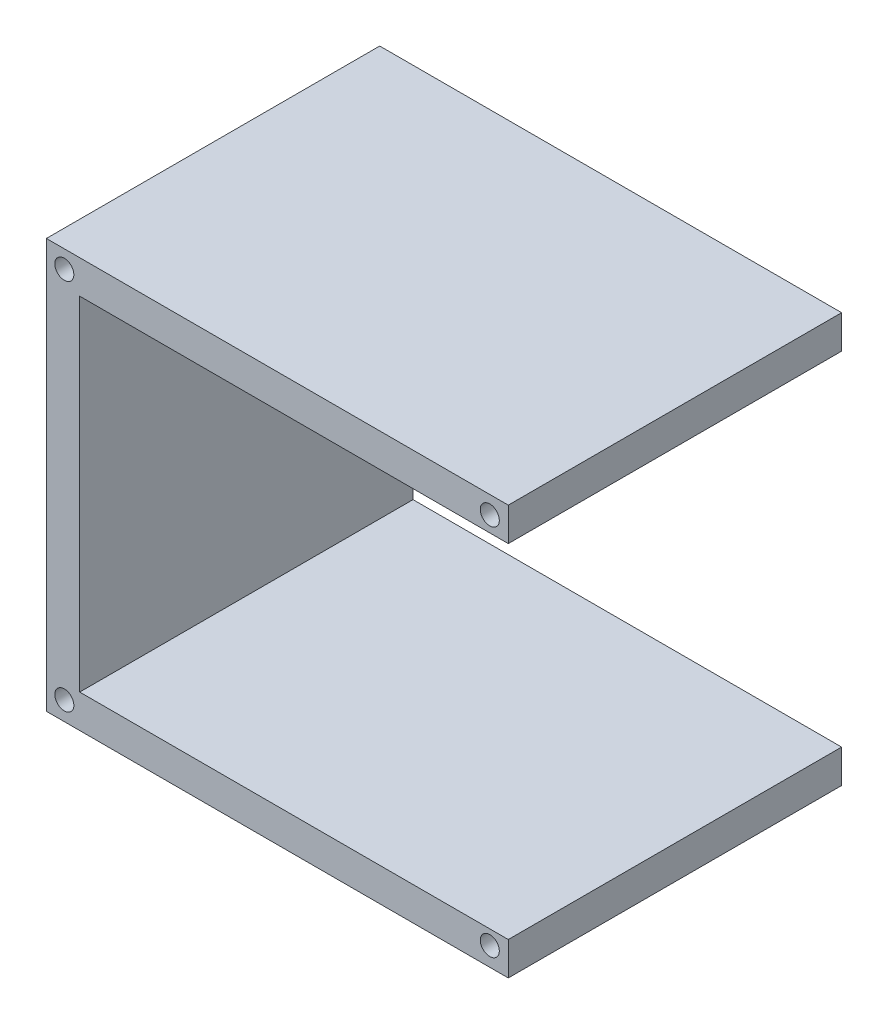
ISO-10303-21;
HEADER;
FILE_DESCRIPTION(('STEP AP214'),'2;1');
FILE_NAME('part.step','',(''),(''),'','','');
FILE_SCHEMA(('AUTOMOTIVE_DESIGN { 1 0 10303 214 1 1 1 1 }'));
ENDSEC;
DATA;
#1=APPLICATION_CONTEXT('core data for automotive mechanical design processes');
#2=APPLICATION_PROTOCOL_DEFINITION('international standard','automotive_design',2000,#1);
#3=PRODUCT_CONTEXT('',#1,'mechanical');
#4=PRODUCT('Part','Part','',(#3));
#5=PRODUCT_RELATED_PRODUCT_CATEGORY('part','',(#4));
#6=PRODUCT_DEFINITION_FORMATION('','',#4);
#7=PRODUCT_DEFINITION_CONTEXT('part definition',#1,'design');
#8=PRODUCT_DEFINITION('design','',#6,#7);
#9=PRODUCT_DEFINITION_SHAPE('','',#8);
#10=(LENGTH_UNIT() NAMED_UNIT(*) SI_UNIT(.MILLI.,.METRE.));
#11=(NAMED_UNIT(*) PLANE_ANGLE_UNIT() SI_UNIT($,.RADIAN.));
#12=(NAMED_UNIT(*) SI_UNIT($,.STERADIAN.) SOLID_ANGLE_UNIT());
#13=UNCERTAINTY_MEASURE_WITH_UNIT(LENGTH_MEASURE(1.E-05),#10,'distance_accuracy_value','');
#14=(GEOMETRIC_REPRESENTATION_CONTEXT(3) GLOBAL_UNCERTAINTY_ASSIGNED_CONTEXT((#13)) GLOBAL_UNIT_ASSIGNED_CONTEXT((#10,
#11,#12)) REPRESENTATION_CONTEXT('',''));
#15=CARTESIAN_POINT('',(0.,0.,0.));
#16=DIRECTION('',(0.,0.,1.));
#17=DIRECTION('',(1.,0.,0.));
#18=AXIS2_PLACEMENT_3D('',#15,#16,#17);
#19=CARTESIAN_POINT('',(0.,43.,35.));
#20=DIRECTION('',(1.,0.,0.));
#21=DIRECTION('',(0.,1.,0.));
#22=AXIS2_PLACEMENT_3D('',#19,#20,#21);
#23=PLANE('',#22);
#24=DIRECTION('',(0.,-1.,0.));
#25=VECTOR('',#24,1.);
#26=CARTESIAN_POINT('',(0.,43.,0.));
#27=LINE('',#26,#25);
#28=CARTESIAN_POINT('',(0.,43.,0.));
#29=VERTEX_POINT('',#28);
#30=CARTESIAN_POINT('',(0.,0.,0.));
#31=VERTEX_POINT('',#30);
#32=EDGE_CURVE('E144',#29,#31,#27,.T.);
#33=ORIENTED_EDGE('',*,*,#32,.T.);
#34=DIRECTION('',(0.,0.,-1.));
#35=VECTOR('',#34,1.);
#36=CARTESIAN_POINT('',(0.,0.,35.));
#37=LINE('',#36,#35);
#38=CARTESIAN_POINT('',(0.,0.,35.));
#39=VERTEX_POINT('',#38);
#40=EDGE_CURVE('E11',#39,#31,#37,.T.);
#41=ORIENTED_EDGE('',*,*,#40,.F.);
#42=DIRECTION('',(0.,-1.,0.));
#43=VECTOR('',#42,1.);
#44=CARTESIAN_POINT('',(0.,43.,35.));
#45=LINE('',#44,#43);
#46=CARTESIAN_POINT('',(0.,43.,35.));
#47=VERTEX_POINT('',#46);
#48=EDGE_CURVE('E167',#47,#39,#45,.T.);
#49=ORIENTED_EDGE('',*,*,#48,.F.);
#50=DIRECTION('',(0.,0.,-1.));
#51=VECTOR('',#50,1.);
#52=CARTESIAN_POINT('',(0.,43.,35.));
#53=LINE('',#52,#51);
#54=EDGE_CURVE('E140',#47,#29,#53,.T.);
#55=ORIENTED_EDGE('',*,*,#54,.T.);
#56=EDGE_LOOP('',(#33,#41,#49,#55));
#57=FACE_BOUND('',#56,.T.);
#58=ADVANCED_FACE('F43',(#57),#23,.F.);
#59=CARTESIAN_POINT('',(0.,0.,35.));
#60=DIRECTION('',(0.,1.,0.));
#61=DIRECTION('',(0.,0.,1.));
#62=AXIS2_PLACEMENT_3D('',#59,#60,#61);
#63=PLANE('',#62);
#64=DIRECTION('',(1.,0.,0.));
#65=VECTOR('',#64,1.);
#66=CARTESIAN_POINT('',(0.,0.,0.));
#67=LINE('',#66,#65);
#68=CARTESIAN_POINT('',(48.5,0.,0.));
#69=VERTEX_POINT('',#68);
#70=EDGE_CURVE('E148',#31,#69,#67,.T.);
#71=ORIENTED_EDGE('',*,*,#70,.T.);
#72=DIRECTION('',(0.,0.,-1.));
#73=VECTOR('',#72,1.);
#74=CARTESIAN_POINT('',(48.5,0.,35.));
#75=LINE('',#74,#73);
#76=CARTESIAN_POINT('',(48.5,0.,35.));
#77=VERTEX_POINT('',#76);
#78=EDGE_CURVE('E52',#77,#69,#75,.T.);
#79=ORIENTED_EDGE('',*,*,#78,.F.);
#80=DIRECTION('',(1.,0.,0.));
#81=VECTOR('',#80,1.);
#82=CARTESIAN_POINT('',(0.,0.,35.));
#83=LINE('',#82,#81);
#84=EDGE_CURVE('E103',#39,#77,#83,.T.);
#85=ORIENTED_EDGE('',*,*,#84,.F.);
#86=ORIENTED_EDGE('',*,*,#40,.T.);
#87=EDGE_LOOP('',(#71,#79,#85,#86));
#88=FACE_BOUND('',#87,.T.);
#89=ADVANCED_FACE('F271',(#88),#63,.F.);
#90=CARTESIAN_POINT('',(48.5,0.,35.));
#91=DIRECTION('',(-1.,0.,0.));
#92=DIRECTION('',(0.,0.,1.));
#93=AXIS2_PLACEMENT_3D('',#90,#91,#92);
#94=PLANE('',#93);
#95=DIRECTION('',(0.,1.,0.));
#96=VECTOR('',#95,1.);
#97=CARTESIAN_POINT('',(48.5,0.,0.));
#98=LINE('',#97,#96);
#99=CARTESIAN_POINT('',(48.5,3.5,0.));
#100=VERTEX_POINT('',#99);
#101=EDGE_CURVE('E152',#69,#100,#98,.T.);
#102=ORIENTED_EDGE('',*,*,#101,.T.);
#103=DIRECTION('',(0.,0.,-1.));
#104=VECTOR('',#103,1.);
#105=CARTESIAN_POINT('',(48.5,3.5,35.));
#106=LINE('',#105,#104);
#107=CARTESIAN_POINT('',(48.5,3.5,35.));
#108=VERTEX_POINT('',#107);
#109=EDGE_CURVE('E178',#108,#100,#106,.T.);
#110=ORIENTED_EDGE('',*,*,#109,.F.);
#111=DIRECTION('',(0.,1.,0.));
#112=VECTOR('',#111,1.);
#113=CARTESIAN_POINT('',(48.5,0.,35.));
#114=LINE('',#113,#112);
#115=EDGE_CURVE('E188',#77,#108,#114,.T.);
#116=ORIENTED_EDGE('',*,*,#115,.F.);
#117=ORIENTED_EDGE('',*,*,#78,.T.);
#118=EDGE_LOOP('',(#102,#110,#116,#117));
#119=FACE_BOUND('',#118,.T.);
#120=ADVANCED_FACE('F186',(#119),#94,.F.);
#121=CARTESIAN_POINT('',(48.5,3.5,35.));
#122=DIRECTION('',(0.,-1.,0.));
#123=DIRECTION('',(1.,0.,0.));
#124=AXIS2_PLACEMENT_3D('',#121,#122,#123);
#125=PLANE('',#124);
#126=DIRECTION('',(-1.,0.,0.));
#127=VECTOR('',#126,1.);
#128=CARTESIAN_POINT('',(48.5,3.5,0.));
#129=LINE('',#128,#127);
#130=CARTESIAN_POINT('',(3.5,3.5,0.));
#131=VERTEX_POINT('',#130);
#132=EDGE_CURVE('E155',#100,#131,#129,.T.);
#133=ORIENTED_EDGE('',*,*,#132,.T.);
#134=DIRECTION('',(0.,0.,-1.));
#135=VECTOR('',#134,1.);
#136=CARTESIAN_POINT('',(3.5,3.5,35.));
#137=LINE('',#136,#135);
#138=CARTESIAN_POINT('',(3.5,3.5,35.));
#139=VERTEX_POINT('',#138);
#140=EDGE_CURVE('E174',#139,#131,#137,.T.);
#141=ORIENTED_EDGE('',*,*,#140,.F.);
#142=DIRECTION('',(-1.,0.,0.));
#143=VECTOR('',#142,1.);
#144=CARTESIAN_POINT('',(48.5,3.5,35.));
#145=LINE('',#144,#143);
#146=EDGE_CURVE('E201',#108,#139,#145,.T.);
#147=ORIENTED_EDGE('',*,*,#146,.F.);
#148=ORIENTED_EDGE('',*,*,#109,.T.);
#149=EDGE_LOOP('',(#133,#141,#147,#148));
#150=FACE_BOUND('',#149,.T.);
#151=ADVANCED_FACE('F196',(#150),#125,.F.);
#152=CARTESIAN_POINT('',(3.5,3.5,35.));
#153=DIRECTION('',(-1.,0.,0.));
#154=DIRECTION('',(0.,-1.,0.));
#155=AXIS2_PLACEMENT_3D('',#152,#153,#154);
#156=PLANE('',#155);
#157=DIRECTION('',(0.,1.,0.));
#158=VECTOR('',#157,1.);
#159=CARTESIAN_POINT('',(3.5,3.5,0.));
#160=LINE('',#159,#158);
#161=CARTESIAN_POINT('',(3.5,39.5,0.));
#162=VERTEX_POINT('',#161);
#163=EDGE_CURVE('E158',#131,#162,#160,.T.);
#164=ORIENTED_EDGE('',*,*,#163,.T.);
#165=DIRECTION('',(0.,0.,-1.));
#166=VECTOR('',#165,1.);
#167=CARTESIAN_POINT('',(3.5,39.5,35.));
#168=LINE('',#167,#166);
#169=CARTESIAN_POINT('',(3.5,39.5,35.));
#170=VERTEX_POINT('',#169);
#171=EDGE_CURVE('E133',#170,#162,#168,.T.);
#172=ORIENTED_EDGE('',*,*,#171,.F.);
#173=DIRECTION('',(0.,1.,0.));
#174=VECTOR('',#173,1.);
#175=CARTESIAN_POINT('',(3.5,3.5,35.));
#176=LINE('',#175,#174);
#177=EDGE_CURVE('E122',#139,#170,#176,.T.);
#178=ORIENTED_EDGE('',*,*,#177,.F.);
#179=ORIENTED_EDGE('',*,*,#140,.T.);
#180=EDGE_LOOP('',(#164,#172,#178,#179));
#181=FACE_BOUND('',#180,.T.);
#182=ADVANCED_FACE('F199',(#181),#156,.F.);
#183=CARTESIAN_POINT('',(3.5,39.5,35.));
#184=DIRECTION('',(0.,1.,0.));
#185=DIRECTION('',(0.,0.,1.));
#186=AXIS2_PLACEMENT_3D('',#183,#184,#185);
#187=PLANE('',#186);
#188=DIRECTION('',(1.,0.,0.));
#189=VECTOR('',#188,1.);
#190=CARTESIAN_POINT('',(3.5,39.5,0.));
#191=LINE('',#190,#189);
#192=CARTESIAN_POINT('',(48.5,39.5,0.));
#193=VERTEX_POINT('',#192);
#194=EDGE_CURVE('E131',#162,#193,#191,.T.);
#195=ORIENTED_EDGE('',*,*,#194,.T.);
#196=DIRECTION('',(0.,0.,-1.));
#197=VECTOR('',#196,1.);
#198=CARTESIAN_POINT('',(48.5,39.5,35.));
#199=LINE('',#198,#197);
#200=CARTESIAN_POINT('',(48.5,39.5,35.));
#201=VERTEX_POINT('',#200);
#202=EDGE_CURVE('E128',#201,#193,#199,.T.);
#203=ORIENTED_EDGE('',*,*,#202,.F.);
#204=DIRECTION('',(1.,0.,0.));
#205=VECTOR('',#204,1.);
#206=CARTESIAN_POINT('',(3.5,39.5,35.));
#207=LINE('',#206,#205);
#208=EDGE_CURVE('E116',#170,#201,#207,.T.);
#209=ORIENTED_EDGE('',*,*,#208,.F.);
#210=ORIENTED_EDGE('',*,*,#171,.T.);
#211=EDGE_LOOP('',(#195,#203,#209,#210));
#212=FACE_BOUND('',#211,.T.);
#213=ADVANCED_FACE('F129',(#212),#187,.F.);
#214=CARTESIAN_POINT('',(48.5,39.5,35.));
#215=DIRECTION('',(-1.,0.,0.));
#216=DIRECTION('',(0.,0.,1.));
#217=AXIS2_PLACEMENT_3D('',#214,#215,#216);
#218=PLANE('',#217);
#219=DIRECTION('',(0.,1.,0.));
#220=VECTOR('',#219,1.);
#221=CARTESIAN_POINT('',(48.5,39.5,0.));
#222=LINE('',#221,#220);
#223=CARTESIAN_POINT('',(48.5,43.,0.));
#224=VERTEX_POINT('',#223);
#225=EDGE_CURVE('E89',#193,#224,#222,.T.);
#226=ORIENTED_EDGE('',*,*,#225,.T.);
#227=DIRECTION('',(0.,0.,-1.));
#228=VECTOR('',#227,1.);
#229=CARTESIAN_POINT('',(48.5,43.,35.));
#230=LINE('',#229,#228);
#231=CARTESIAN_POINT('',(48.5,43.,35.));
#232=VERTEX_POINT('',#231);
#233=EDGE_CURVE('E134',#232,#224,#230,.T.);
#234=ORIENTED_EDGE('',*,*,#233,.F.);
#235=DIRECTION('',(0.,1.,0.));
#236=VECTOR('',#235,1.);
#237=CARTESIAN_POINT('',(48.5,39.5,35.));
#238=LINE('',#237,#236);
#239=EDGE_CURVE('E120',#201,#232,#238,.T.);
#240=ORIENTED_EDGE('',*,*,#239,.F.);
#241=ORIENTED_EDGE('',*,*,#202,.T.);
#242=EDGE_LOOP('',(#226,#234,#240,#241));
#243=FACE_BOUND('',#242,.T.);
#244=ADVANCED_FACE('F136',(#243),#218,.F.);
#245=CARTESIAN_POINT('',(48.5,43.,35.));
#246=DIRECTION('',(0.,-1.,0.));
#247=DIRECTION('',(1.,0.,0.));
#248=AXIS2_PLACEMENT_3D('',#245,#246,#247);
#249=PLANE('',#248);
#250=DIRECTION('',(-1.,0.,0.));
#251=VECTOR('',#250,1.);
#252=CARTESIAN_POINT('',(48.5,43.,0.));
#253=LINE('',#252,#251);
#254=EDGE_CURVE('E95',#224,#29,#253,.T.);
#255=ORIENTED_EDGE('',*,*,#254,.T.);
#256=ORIENTED_EDGE('',*,*,#54,.F.);
#257=DIRECTION('',(-1.,0.,0.));
#258=VECTOR('',#257,1.);
#259=CARTESIAN_POINT('',(48.5,43.,35.));
#260=LINE('',#259,#258);
#261=EDGE_CURVE('E60',#232,#47,#260,.T.);
#262=ORIENTED_EDGE('',*,*,#261,.F.);
#263=ORIENTED_EDGE('',*,*,#233,.T.);
#264=EDGE_LOOP('',(#255,#256,#262,#263));
#265=FACE_BOUND('',#264,.T.);
#266=ADVANCED_FACE('F247',(#265),#249,.F.);
#267=CARTESIAN_POINT('',(0.,0.,35.));
#268=DIRECTION('',(0.,0.,1.));
#269=DIRECTION('',(1.,0.,0.));
#270=AXIS2_PLACEMENT_3D('',#267,#268,#269);
#271=PLANE('',#270);
#272=CARTESIAN_POINT('',(46.5575087678012,1.9809298281741,35.));
#273=DIRECTION('',(0.,0.,1.));
#274=DIRECTION('',(1.,0.,0.));
#275=AXIS2_PLACEMENT_3D('',#272,#273,#274);
#276=CIRCLE('',#275,0.999999999999987);
#277=CARTESIAN_POINT('',(47.5575087678012,1.9809298281741,35.));
#278=VERTEX_POINT('',#277);
#279=EDGE_CURVE('E238',#278,#278,#276,.T.);
#280=ORIENTED_EDGE('',*,*,#279,.F.);
#281=EDGE_LOOP('',(#280));
#282=FACE_BOUND('',#281,.T.);
#283=CARTESIAN_POINT('',(1.88252481078002,1.9809298281741,35.));
#284=DIRECTION('',(0.,0.,1.));
#285=DIRECTION('',(1.,0.,0.));
#286=AXIS2_PLACEMENT_3D('',#283,#284,#285);
#287=CIRCLE('',#286,0.999999999999987);
#288=CARTESIAN_POINT('',(2.88252481078,1.9809298281741,35.));
#289=VERTEX_POINT('',#288);
#290=EDGE_CURVE('E230',#289,#289,#287,.T.);
#291=ORIENTED_EDGE('',*,*,#290,.F.);
#292=EDGE_LOOP('',(#291));
#293=FACE_BOUND('',#292,.T.);
#294=CARTESIAN_POINT('',(1.88252481078002,41.1390030146638,35.));
#295=DIRECTION('',(0.,0.,1.));
#296=DIRECTION('',(1.,0.,0.));
#297=AXIS2_PLACEMENT_3D('',#294,#295,#296);
#298=CIRCLE('',#297,0.999999999999987);
#299=CARTESIAN_POINT('',(2.88252481078,41.1390030146638,35.));
#300=VERTEX_POINT('',#299);
#301=EDGE_CURVE('E222',#300,#300,#298,.T.);
#302=ORIENTED_EDGE('',*,*,#301,.F.);
#303=EDGE_LOOP('',(#302));
#304=FACE_BOUND('',#303,.T.);
#305=CARTESIAN_POINT('',(46.5575087678012,41.1390030146638,35.));
#306=DIRECTION('',(0.,0.,1.));
#307=DIRECTION('',(1.,0.,0.));
#308=AXIS2_PLACEMENT_3D('',#305,#306,#307);
#309=CIRCLE('',#308,0.999999999999987);
#310=CARTESIAN_POINT('',(47.5575087678012,41.1390030146638,35.));
#311=VERTEX_POINT('',#310);
#312=EDGE_CURVE('E214',#311,#311,#309,.T.);
#313=ORIENTED_EDGE('',*,*,#312,.F.);
#314=EDGE_LOOP('',(#313));
#315=FACE_BOUND('',#314,.T.);
#316=ORIENTED_EDGE('',*,*,#48,.T.);
#317=ORIENTED_EDGE('',*,*,#84,.T.);
#318=ORIENTED_EDGE('',*,*,#115,.T.);
#319=ORIENTED_EDGE('',*,*,#146,.T.);
#320=ORIENTED_EDGE('',*,*,#177,.T.);
#321=ORIENTED_EDGE('',*,*,#208,.T.);
#322=ORIENTED_EDGE('',*,*,#239,.T.);
#323=ORIENTED_EDGE('',*,*,#261,.T.);
#324=EDGE_LOOP('',(#316,#317,#318,#319,#320,#321,#322,#323));
#325=FACE_BOUND('',#324,.T.);
#326=ADVANCED_FACE('F118',(#282,#293,#304,#315,#325),#271,.T.);
#327=CARTESIAN_POINT('',(0.,0.,0.));
#328=DIRECTION('',(0.,0.,1.));
#329=DIRECTION('',(1.,0.,0.));
#330=AXIS2_PLACEMENT_3D('',#327,#328,#329);
#331=PLANE('',#330);
#332=CARTESIAN_POINT('',(46.5575087678012,1.9809298281741,0.));
#333=DIRECTION('',(0.,0.,1.));
#334=DIRECTION('',(1.,0.,0.));
#335=AXIS2_PLACEMENT_3D('',#332,#333,#334);
#336=CIRCLE('',#335,0.999999999999994);
#337=CARTESIAN_POINT('',(47.5575087678012,1.9809298281741,0.));
#338=VERTEX_POINT('',#337);
#339=EDGE_CURVE('E234',#338,#338,#336,.T.);
#340=ORIENTED_EDGE('',*,*,#339,.T.);
#341=EDGE_LOOP('',(#340));
#342=FACE_BOUND('',#341,.T.);
#343=CARTESIAN_POINT('',(1.88252481078002,1.9809298281741,0.));
#344=DIRECTION('',(0.,0.,1.));
#345=DIRECTION('',(1.,0.,0.));
#346=AXIS2_PLACEMENT_3D('',#343,#344,#345);
#347=CIRCLE('',#346,0.999999999999995);
#348=CARTESIAN_POINT('',(2.88252481078001,1.9809298281741,0.));
#349=VERTEX_POINT('',#348);
#350=EDGE_CURVE('E226',#349,#349,#347,.T.);
#351=ORIENTED_EDGE('',*,*,#350,.T.);
#352=EDGE_LOOP('',(#351));
#353=FACE_BOUND('',#352,.T.);
#354=CARTESIAN_POINT('',(1.88252481078002,41.1390030146638,0.));
#355=DIRECTION('',(0.,0.,1.));
#356=DIRECTION('',(1.,0.,0.));
#357=AXIS2_PLACEMENT_3D('',#354,#355,#356);
#358=CIRCLE('',#357,0.999999999999995);
#359=CARTESIAN_POINT('',(2.88252481078001,41.1390030146638,0.));
#360=VERTEX_POINT('',#359);
#361=EDGE_CURVE('E218',#360,#360,#358,.T.);
#362=ORIENTED_EDGE('',*,*,#361,.T.);
#363=EDGE_LOOP('',(#362));
#364=FACE_BOUND('',#363,.T.);
#365=CARTESIAN_POINT('',(46.5575087678012,41.1390030146638,0.));
#366=DIRECTION('',(0.,0.,1.));
#367=DIRECTION('',(1.,0.,0.));
#368=AXIS2_PLACEMENT_3D('',#365,#366,#367);
#369=CIRCLE('',#368,0.999999999999994);
#370=CARTESIAN_POINT('',(47.5575087678012,41.1390030146638,0.));
#371=VERTEX_POINT('',#370);
#372=EDGE_CURVE('E149',#371,#371,#369,.T.);
#373=ORIENTED_EDGE('',*,*,#372,.T.);
#374=EDGE_LOOP('',(#373));
#375=FACE_BOUND('',#374,.T.);
#376=ORIENTED_EDGE('',*,*,#32,.F.);
#377=ORIENTED_EDGE('',*,*,#254,.F.);
#378=ORIENTED_EDGE('',*,*,#225,.F.);
#379=ORIENTED_EDGE('',*,*,#194,.F.);
#380=ORIENTED_EDGE('',*,*,#163,.F.);
#381=ORIENTED_EDGE('',*,*,#132,.F.);
#382=ORIENTED_EDGE('',*,*,#101,.F.);
#383=ORIENTED_EDGE('',*,*,#70,.F.);
#384=EDGE_LOOP('',(#376,#377,#378,#379,#380,#381,#382,#383));
#385=FACE_BOUND('',#384,.T.);
#386=ADVANCED_FACE('F192',(#342,#353,#364,#375,#385),#331,.F.);
#387=CARTESIAN_POINT('',(46.5575087678012,41.1390030146638,35.));
#388=DIRECTION('',(0.,0.,1.));
#389=DIRECTION('',(1.,0.,0.));
#390=AXIS2_PLACEMENT_3D('',#387,#388,#389);
#391=CYLINDRICAL_SURFACE('',#390,0.99999999999999);
#392=ORIENTED_EDGE('',*,*,#372,.F.);
#393=EDGE_LOOP('',(#392));
#394=FACE_BOUND('',#393,.T.);
#395=ORIENTED_EDGE('',*,*,#312,.T.);
#396=EDGE_LOOP('',(#395));
#397=FACE_BOUND('',#396,.T.);
#398=ADVANCED_FACE('F255',(#394,#397),#391,.F.);
#399=CARTESIAN_POINT('',(1.88252481078002,41.1390030146638,35.));
#400=DIRECTION('',(0.,0.,1.));
#401=DIRECTION('',(1.,0.,0.));
#402=AXIS2_PLACEMENT_3D('',#399,#400,#401);
#403=CYLINDRICAL_SURFACE('',#402,0.999999999999991);
#404=ORIENTED_EDGE('',*,*,#361,.F.);
#405=EDGE_LOOP('',(#404));
#406=FACE_BOUND('',#405,.T.);
#407=ORIENTED_EDGE('',*,*,#301,.T.);
#408=EDGE_LOOP('',(#407));
#409=FACE_BOUND('',#408,.T.);
#410=ADVANCED_FACE('F257',(#406,#409),#403,.F.);
#411=CARTESIAN_POINT('',(1.88252481078002,1.9809298281741,35.));
#412=DIRECTION('',(0.,0.,1.));
#413=DIRECTION('',(1.,0.,0.));
#414=AXIS2_PLACEMENT_3D('',#411,#412,#413);
#415=CYLINDRICAL_SURFACE('',#414,0.999999999999991);
#416=ORIENTED_EDGE('',*,*,#350,.F.);
#417=EDGE_LOOP('',(#416));
#418=FACE_BOUND('',#417,.T.);
#419=ORIENTED_EDGE('',*,*,#290,.T.);
#420=EDGE_LOOP('',(#419));
#421=FACE_BOUND('',#420,.T.);
#422=ADVANCED_FACE('F264',(#418,#421),#415,.F.);
#423=CARTESIAN_POINT('',(46.5575087678012,1.9809298281741,35.));
#424=DIRECTION('',(0.,0.,1.));
#425=DIRECTION('',(1.,0.,0.));
#426=AXIS2_PLACEMENT_3D('',#423,#424,#425);
#427=CYLINDRICAL_SURFACE('',#426,0.99999999999999);
#428=ORIENTED_EDGE('',*,*,#339,.F.);
#429=EDGE_LOOP('',(#428));
#430=FACE_BOUND('',#429,.T.);
#431=ORIENTED_EDGE('',*,*,#279,.T.);
#432=EDGE_LOOP('',(#431));
#433=FACE_BOUND('',#432,.T.);
#434=ADVANCED_FACE('F243',(#430,#433),#427,.F.);
#435=CLOSED_SHELL('',(#58,#89,#120,#151,#182,#213,#244,#266,#326,#386,#398,#410,#422,#434));
#436=MANIFOLD_SOLID_BREP('B2',#435);
#437=ADVANCED_BREP_SHAPE_REPRESENTATION('',(#18,#436),#14);
#438=SHAPE_DEFINITION_REPRESENTATION(#9,#437);
ENDSEC;
END-ISO-10303-21;
